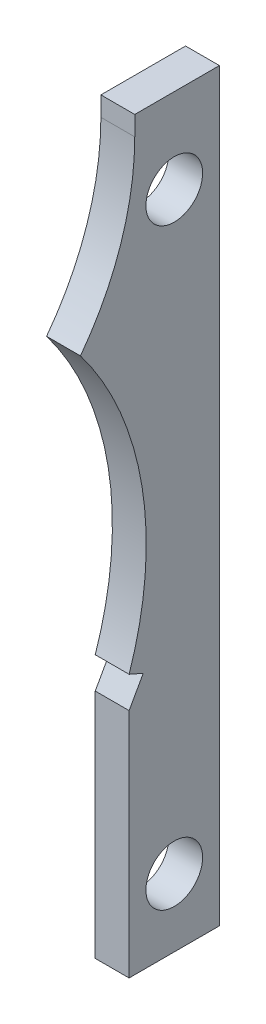
ISO-10303-21;
HEADER;
FILE_DESCRIPTION(('STEP AP214'),'2;1');
FILE_NAME('part.step','',(''),(''),'','','');
FILE_SCHEMA(('AUTOMOTIVE_DESIGN { 1 0 10303 214 1 1 1 1 }'));
ENDSEC;
DATA;
#1=APPLICATION_CONTEXT('core data for automotive mechanical design processes');
#2=APPLICATION_PROTOCOL_DEFINITION('international standard','automotive_design',2000,#1);
#3=PRODUCT_CONTEXT('',#1,'mechanical');
#4=PRODUCT('Part','Part','',(#3));
#5=PRODUCT_RELATED_PRODUCT_CATEGORY('part','',(#4));
#6=PRODUCT_DEFINITION_FORMATION('','',#4);
#7=PRODUCT_DEFINITION_CONTEXT('part definition',#1,'design');
#8=PRODUCT_DEFINITION('design','',#6,#7);
#9=PRODUCT_DEFINITION_SHAPE('','',#8);
#10=(LENGTH_UNIT() NAMED_UNIT(*) SI_UNIT(.MILLI.,.METRE.));
#11=(NAMED_UNIT(*) PLANE_ANGLE_UNIT() SI_UNIT($,.RADIAN.));
#12=(NAMED_UNIT(*) SI_UNIT($,.STERADIAN.) SOLID_ANGLE_UNIT());
#13=UNCERTAINTY_MEASURE_WITH_UNIT(LENGTH_MEASURE(1.E-05),#10,'distance_accuracy_value','');
#14=(GEOMETRIC_REPRESENTATION_CONTEXT(3) GLOBAL_UNCERTAINTY_ASSIGNED_CONTEXT((#13)) GLOBAL_UNIT_ASSIGNED_CONTEXT((#10,
#11,#12)) REPRESENTATION_CONTEXT('',''));
#15=CARTESIAN_POINT('',(0.,0.,0.));
#16=DIRECTION('',(0.,0.,1.));
#17=DIRECTION('',(1.,0.,0.));
#18=AXIS2_PLACEMENT_3D('',#15,#16,#17);
#19=CARTESIAN_POINT('',(3.,66.,0.));
#20=DIRECTION('',(0.,0.,1.));
#21=DIRECTION('',(0.,-1.,0.));
#22=AXIS2_PLACEMENT_3D('',#19,#20,#21);
#23=PLANE('',#22);
#24=DIRECTION('',(0.,1.,0.));
#25=VECTOR('',#24,1.);
#26=CARTESIAN_POINT('',(-3.,66.,0.));
#27=LINE('',#26,#25);
#28=CARTESIAN_POINT('',(-3.,-66.,0.));
#29=VERTEX_POINT('',#28);
#30=CARTESIAN_POINT('',(-3.,66.,0.));
#31=VERTEX_POINT('',#30);
#32=EDGE_CURVE('E134',#29,#31,#27,.T.);
#33=ORIENTED_EDGE('',*,*,#32,.T.);
#34=DIRECTION('',(-1.,0.,0.));
#35=VECTOR('',#34,1.);
#36=CARTESIAN_POINT('',(3.,66.,0.));
#37=LINE('',#36,#35);
#38=CARTESIAN_POINT('',(3.,66.,0.));
#39=VERTEX_POINT('',#38);
#40=EDGE_CURVE('E11',#39,#31,#37,.T.);
#41=ORIENTED_EDGE('',*,*,#40,.F.);
#42=DIRECTION('',(0.,1.,0.));
#43=VECTOR('',#42,1.);
#44=CARTESIAN_POINT('',(3.,66.,0.));
#45=LINE('',#44,#43);
#46=CARTESIAN_POINT('',(3.,-66.,0.));
#47=VERTEX_POINT('',#46);
#48=EDGE_CURVE('E151',#47,#39,#45,.T.);
#49=ORIENTED_EDGE('',*,*,#48,.F.);
#50=DIRECTION('',(-1.,0.,0.));
#51=VECTOR('',#50,1.);
#52=CARTESIAN_POINT('',(3.,-66.,0.));
#53=LINE('',#52,#51);
#54=EDGE_CURVE('E130',#47,#29,#53,.T.);
#55=ORIENTED_EDGE('',*,*,#54,.T.);
#56=EDGE_LOOP('',(#33,#41,#49,#55));
#57=FACE_BOUND('',#56,.T.);
#58=ADVANCED_FACE('F32',(#57),#23,.F.);
#59=CARTESIAN_POINT('',(3.,66.,0.));
#60=DIRECTION('',(0.,-1.,0.));
#61=DIRECTION('',(0.,0.,-1.));
#62=AXIS2_PLACEMENT_3D('',#59,#60,#61);
#63=PLANE('',#62);
#64=DIRECTION('',(0.,0.,1.));
#65=VECTOR('',#64,1.);
#66=CARTESIAN_POINT('',(-3.,66.,0.));
#67=LINE('',#66,#65);
#68=CARTESIAN_POINT('',(-3.,66.,15.));
#69=VERTEX_POINT('',#68);
#70=EDGE_CURVE('E137',#31,#69,#67,.T.);
#71=ORIENTED_EDGE('',*,*,#70,.T.);
#72=DIRECTION('',(-1.,0.,0.));
#73=VECTOR('',#72,1.);
#74=CARTESIAN_POINT('',(3.,66.,15.));
#75=LINE('',#74,#73);
#76=CARTESIAN_POINT('',(3.,66.,15.));
#77=VERTEX_POINT('',#76);
#78=EDGE_CURVE('E40',#77,#69,#75,.T.);
#79=ORIENTED_EDGE('',*,*,#78,.F.);
#80=DIRECTION('',(0.,0.,1.));
#81=VECTOR('',#80,1.);
#82=CARTESIAN_POINT('',(3.,66.,0.));
#83=LINE('',#82,#81);
#84=EDGE_CURVE('E94',#39,#77,#83,.T.);
#85=ORIENTED_EDGE('',*,*,#84,.F.);
#86=ORIENTED_EDGE('',*,*,#40,.T.);
#87=EDGE_LOOP('',(#71,#79,#85,#86));
#88=FACE_BOUND('',#87,.T.);
#89=ADVANCED_FACE('F228',(#88),#63,.F.);
#90=CARTESIAN_POINT('',(3.,66.,15.));
#91=DIRECTION('',(0.,0.,-1.));
#92=DIRECTION('',(0.,1.,0.));
#93=AXIS2_PLACEMENT_3D('',#90,#91,#92);
#94=PLANE('',#93);
#95=DIRECTION('',(0.,-1.,0.));
#96=VECTOR('',#95,1.);
#97=CARTESIAN_POINT('',(-3.,66.,15.));
#98=LINE('',#97,#96);
#99=CARTESIAN_POINT('',(-3.,62.56,15.));
#100=VERTEX_POINT('',#99);
#101=EDGE_CURVE('E140',#69,#100,#98,.T.);
#102=ORIENTED_EDGE('',*,*,#101,.T.);
#103=DIRECTION('',(-1.,0.,0.));
#104=VECTOR('',#103,1.);
#105=CARTESIAN_POINT('',(3.,62.56,15.));
#106=LINE('',#105,#104);
#107=CARTESIAN_POINT('',(3.,62.56,15.));
#108=VERTEX_POINT('',#107);
#109=EDGE_CURVE('E161',#108,#100,#106,.T.);
#110=ORIENTED_EDGE('',*,*,#109,.F.);
#111=DIRECTION('',(0.,-1.,0.));
#112=VECTOR('',#111,1.);
#113=CARTESIAN_POINT('',(3.,66.,15.));
#114=LINE('',#113,#112);
#115=EDGE_CURVE('E169',#77,#108,#114,.T.);
#116=ORIENTED_EDGE('',*,*,#115,.F.);
#117=ORIENTED_EDGE('',*,*,#78,.T.);
#118=EDGE_LOOP('',(#102,#110,#116,#117));
#119=FACE_BOUND('',#118,.T.);
#120=ADVANCED_FACE('F167',(#119),#94,.F.);
#121=CARTESIAN_POINT('',(3.,62.56,62.9));
#122=DIRECTION('',(-1.,0.,0.));
#123=DIRECTION('',(0.,0.,1.));
#124=AXIS2_PLACEMENT_3D('',#121,#122,#123);
#125=CYLINDRICAL_SURFACE('',#124,47.9);
#126=CARTESIAN_POINT('',(-3.,62.56,62.9));
#127=DIRECTION('',(-1.,0.,0.));
#128=DIRECTION('',(0.,0.,-1.));
#129=AXIS2_PLACEMENT_3D('',#126,#127,#128);
#130=CIRCLE('',#129,47.9);
#131=CARTESIAN_POINT('',(-3.,33.7654535309983,24.6209705759863));
#132=VERTEX_POINT('',#131);
#133=EDGE_CURVE('E142',#100,#132,#130,.T.);
#134=ORIENTED_EDGE('',*,*,#133,.T.);
#135=DIRECTION('',(-1.,0.,0.));
#136=VECTOR('',#135,1.);
#137=CARTESIAN_POINT('',(3.,33.7654535309983,24.6209705759863));
#138=LINE('',#137,#136);
#139=CARTESIAN_POINT('',(3.,33.7654535309983,24.6209705759863));
#140=VERTEX_POINT('',#139);
#141=EDGE_CURVE('E158',#140,#132,#138,.T.);
#142=ORIENTED_EDGE('',*,*,#141,.F.);
#143=CARTESIAN_POINT('',(3.,62.56,62.9));
#144=DIRECTION('',(-1.,0.,0.));
#145=DIRECTION('',(0.,0.,-1.));
#146=AXIS2_PLACEMENT_3D('',#143,#144,#145);
#147=CIRCLE('',#146,47.9);
#148=EDGE_CURVE('E185',#108,#140,#147,.T.);
#149=ORIENTED_EDGE('',*,*,#148,.F.);
#150=ORIENTED_EDGE('',*,*,#109,.T.);
#151=EDGE_LOOP('',(#134,#142,#149,#150));
#152=FACE_BOUND('',#151,.T.);
#153=ADVANCED_FACE('F178',(#152),#125,.F.);
#154=CARTESIAN_POINT('',(3.,-0.959999999999997,70.52));
#155=DIRECTION('',(-1.,0.,0.));
#156=DIRECTION('',(0.,0.,1.));
#157=AXIS2_PLACEMENT_3D('',#154,#155,#156);
#158=CYLINDRICAL_SURFACE('',#157,57.555);
#159=CARTESIAN_POINT('',(-3.,-0.959999999999997,70.52));
#160=DIRECTION('',(-1.,0.,0.));
#161=DIRECTION('',(0.,0.,-1.));
#162=AXIS2_PLACEMENT_3D('',#159,#160,#161);
#163=CIRCLE('',#162,57.555);
#164=CARTESIAN_POINT('',(-3.,-19.4030915250129,16.));
#165=VERTEX_POINT('',#164);
#166=EDGE_CURVE('E144',#132,#165,#163,.T.);
#167=ORIENTED_EDGE('',*,*,#166,.T.);
#168=DIRECTION('',(-1.,0.,0.));
#169=VECTOR('',#168,1.);
#170=CARTESIAN_POINT('',(3.,-19.4030915250129,16.));
#171=LINE('',#170,#169);
#172=CARTESIAN_POINT('',(3.,-19.4030915250129,16.));
#173=VERTEX_POINT('',#172);
#174=EDGE_CURVE('E155',#173,#165,#171,.T.);
#175=ORIENTED_EDGE('',*,*,#174,.F.);
#176=CARTESIAN_POINT('',(3.,-0.959999999999997,70.52));
#177=DIRECTION('',(-1.,0.,0.));
#178=DIRECTION('',(0.,0.,-1.));
#179=AXIS2_PLACEMENT_3D('',#176,#177,#178);
#180=CIRCLE('',#179,57.555);
#181=EDGE_CURVE('E184',#140,#173,#180,.T.);
#182=ORIENTED_EDGE('',*,*,#181,.F.);
#183=ORIENTED_EDGE('',*,*,#141,.T.);
#184=EDGE_LOOP('',(#167,#175,#182,#183));
#185=FACE_BOUND('',#184,.T.);
#186=ADVANCED_FACE('F182',(#185),#158,.F.);
#187=CARTESIAN_POINT('',(3.,-19.4030915250129,16.));
#188=DIRECTION('',(0.,0.915494413653172,-0.402330683107607));
#189=DIRECTION('',(0.,0.402330683107607,0.915494413653173));
#190=AXIS2_PLACEMENT_3D('',#187,#188,#189);
#191=PLANE('',#190);
#192=DIRECTION('',(0.,-0.402330683107607,-0.915494413653173));
#193=VECTOR('',#192,1.);
#194=CARTESIAN_POINT('',(-3.,-19.4030915250129,16.));
#195=LINE('',#194,#193);
#196=CARTESIAN_POINT('',(-3.,-20.5014542898966,13.5007002507268));
#197=VERTEX_POINT('',#196);
#198=EDGE_CURVE('E146',#165,#197,#195,.T.);
#199=ORIENTED_EDGE('',*,*,#198,.T.);
#200=DIRECTION('',(-1.,0.,0.));
#201=VECTOR('',#200,1.);
#202=CARTESIAN_POINT('',(3.,-20.5014542898966,13.5007002507268));
#203=LINE('',#202,#201);
#204=CARTESIAN_POINT('',(3.,-20.5014542898966,13.5007002507268));
#205=VERTEX_POINT('',#204);
#206=EDGE_CURVE('E125',#205,#197,#203,.T.);
#207=ORIENTED_EDGE('',*,*,#206,.F.);
#208=DIRECTION('',(0.,-0.402330683107607,-0.915494413653173));
#209=VECTOR('',#208,1.);
#210=CARTESIAN_POINT('',(3.,-19.4030915250129,16.));
#211=LINE('',#210,#209);
#212=EDGE_CURVE('E116',#173,#205,#211,.T.);
#213=ORIENTED_EDGE('',*,*,#212,.F.);
#214=ORIENTED_EDGE('',*,*,#174,.T.);
#215=EDGE_LOOP('',(#199,#207,#213,#214));
#216=FACE_BOUND('',#215,.T.);
#217=ADVANCED_FACE('F236',(#216),#191,.F.);
#218=CARTESIAN_POINT('',(3.,-20.5014542898966,13.5007002507268));
#219=DIRECTION('',(0.,-0.488144482279914,-0.872762834004562));
#220=DIRECTION('',(0.,0.872762834004562,-0.488144482279914));
#221=AXIS2_PLACEMENT_3D('',#218,#219,#220);
#222=PLANE('',#221);
#223=DIRECTION('',(0.,-0.872762834004562,0.488144482279914));
#224=VECTOR('',#223,1.);
#225=CARTESIAN_POINT('',(-3.,-20.5014542898966,13.5007002507268));
#226=LINE('',#225,#224);
#227=CARTESIAN_POINT('',(-3.,-24.97,16.));
#228=VERTEX_POINT('',#227);
#229=EDGE_CURVE('E124',#197,#228,#226,.T.);
#230=ORIENTED_EDGE('',*,*,#229,.T.);
#231=DIRECTION('',(-1.,0.,0.));
#232=VECTOR('',#231,1.);
#233=CARTESIAN_POINT('',(3.,-24.97,16.));
#234=LINE('',#233,#232);
#235=CARTESIAN_POINT('',(3.,-24.97,16.));
#236=VERTEX_POINT('',#235);
#237=EDGE_CURVE('E121',#236,#228,#234,.T.);
#238=ORIENTED_EDGE('',*,*,#237,.F.);
#239=DIRECTION('',(0.,-0.872762834004562,0.488144482279914));
#240=VECTOR('',#239,1.);
#241=CARTESIAN_POINT('',(3.,-20.5014542898966,13.5007002507268));
#242=LINE('',#241,#240);
#243=EDGE_CURVE('E110',#205,#236,#242,.T.);
#244=ORIENTED_EDGE('',*,*,#243,.F.);
#245=ORIENTED_EDGE('',*,*,#206,.T.);
#246=EDGE_LOOP('',(#230,#238,#244,#245));
#247=FACE_BOUND('',#246,.T.);
#248=ADVANCED_FACE('F122',(#247),#222,.F.);
#249=CARTESIAN_POINT('',(3.,-24.97,16.));
#250=DIRECTION('',(0.,0.,-1.));
#251=DIRECTION('',(0.,1.,0.));
#252=AXIS2_PLACEMENT_3D('',#249,#250,#251);
#253=PLANE('',#252);
#254=DIRECTION('',(0.,-1.,0.));
#255=VECTOR('',#254,1.);
#256=CARTESIAN_POINT('',(-3.,-24.97,16.));
#257=LINE('',#256,#255);
#258=CARTESIAN_POINT('',(-3.,-66.,16.));
#259=VERTEX_POINT('',#258);
#260=EDGE_CURVE('E80',#228,#259,#257,.T.);
#261=ORIENTED_EDGE('',*,*,#260,.T.);
#262=DIRECTION('',(-1.,0.,0.));
#263=VECTOR('',#262,1.);
#264=CARTESIAN_POINT('',(3.,-66.,16.));
#265=LINE('',#264,#263);
#266=CARTESIAN_POINT('',(3.,-66.,16.));
#267=VERTEX_POINT('',#266);
#268=EDGE_CURVE('E126',#267,#259,#265,.T.);
#269=ORIENTED_EDGE('',*,*,#268,.F.);
#270=DIRECTION('',(0.,-1.,0.));
#271=VECTOR('',#270,1.);
#272=CARTESIAN_POINT('',(3.,-24.97,16.));
#273=LINE('',#272,#271);
#274=EDGE_CURVE('E114',#236,#267,#273,.T.);
#275=ORIENTED_EDGE('',*,*,#274,.F.);
#276=ORIENTED_EDGE('',*,*,#237,.T.);
#277=EDGE_LOOP('',(#261,#269,#275,#276));
#278=FACE_BOUND('',#277,.T.);
#279=ADVANCED_FACE('F128',(#278),#253,.F.);
#280=CARTESIAN_POINT('',(3.,-66.,0.));
#281=DIRECTION('',(0.,1.,0.));
#282=DIRECTION('',(0.,0.,1.));
#283=AXIS2_PLACEMENT_3D('',#280,#281,#282);
#284=PLANE('',#283);
#285=DIRECTION('',(0.,0.,-1.));
#286=VECTOR('',#285,1.);
#287=CARTESIAN_POINT('',(-3.,-66.,0.));
#288=LINE('',#287,#286);
#289=EDGE_CURVE('E86',#259,#29,#288,.T.);
#290=ORIENTED_EDGE('',*,*,#289,.T.);
#291=ORIENTED_EDGE('',*,*,#54,.F.);
#292=DIRECTION('',(0.,0.,-1.));
#293=VECTOR('',#292,1.);
#294=CARTESIAN_POINT('',(3.,-66.,0.));
#295=LINE('',#294,#293);
#296=EDGE_CURVE('E48',#267,#47,#295,.T.);
#297=ORIENTED_EDGE('',*,*,#296,.F.);
#298=ORIENTED_EDGE('',*,*,#268,.T.);
#299=EDGE_LOOP('',(#290,#291,#297,#298));
#300=FACE_BOUND('',#299,.T.);
#301=ADVANCED_FACE('F215',(#300),#284,.F.);
#302=CARTESIAN_POINT('',(3.,-0.959999999999997,70.52));
#303=DIRECTION('',(1.,0.,0.));
#304=DIRECTION('',(0.,0.,-1.));
#305=AXIS2_PLACEMENT_3D('',#302,#303,#304);
#306=PLANE('',#305);
#307=CARTESIAN_POINT('',(3.,51.,8.));
#308=DIRECTION('',(1.,0.,0.));
#309=DIRECTION('',(0.,0.,-1.));
#310=AXIS2_PLACEMENT_3D('',#307,#308,#309);
#311=CIRCLE('',#310,5.025);
#312=CARTESIAN_POINT('',(3.,51.,2.975));
#313=VERTEX_POINT('',#312);
#314=EDGE_CURVE('E198',#313,#313,#311,.T.);
#315=ORIENTED_EDGE('',*,*,#314,.F.);
#316=EDGE_LOOP('',(#315));
#317=FACE_BOUND('',#316,.T.);
#318=CARTESIAN_POINT('',(3.,-54.,8.));
#319=DIRECTION('',(1.,0.,0.));
#320=DIRECTION('',(0.,0.,-1.));
#321=AXIS2_PLACEMENT_3D('',#318,#319,#320);
#322=CIRCLE('',#321,5.025);
#323=CARTESIAN_POINT('',(3.,-54.,2.975));
#324=VERTEX_POINT('',#323);
#325=EDGE_CURVE('E192',#324,#324,#322,.T.);
#326=ORIENTED_EDGE('',*,*,#325,.F.);
#327=EDGE_LOOP('',(#326));
#328=FACE_BOUND('',#327,.T.);
#329=ORIENTED_EDGE('',*,*,#48,.T.);
#330=ORIENTED_EDGE('',*,*,#84,.T.);
#331=ORIENTED_EDGE('',*,*,#115,.T.);
#332=ORIENTED_EDGE('',*,*,#148,.T.);
#333=ORIENTED_EDGE('',*,*,#181,.T.);
#334=ORIENTED_EDGE('',*,*,#212,.T.);
#335=ORIENTED_EDGE('',*,*,#243,.T.);
#336=ORIENTED_EDGE('',*,*,#274,.T.);
#337=ORIENTED_EDGE('',*,*,#296,.T.);
#338=EDGE_LOOP('',(#329,#330,#331,#332,#333,#334,#335,#336,#337));
#339=FACE_BOUND('',#338,.T.);
#340=ADVANCED_FACE('F112',(#317,#328,#339),#306,.T.);
#341=CARTESIAN_POINT('',(-3.,-0.959999999999997,70.52));
#342=DIRECTION('',(1.,0.,0.));
#343=DIRECTION('',(0.,0.,-1.));
#344=AXIS2_PLACEMENT_3D('',#341,#342,#343);
#345=PLANE('',#344);
#346=CARTESIAN_POINT('',(-3.,51.,8.));
#347=DIRECTION('',(1.,0.,0.));
#348=DIRECTION('',(0.,0.,-1.));
#349=AXIS2_PLACEMENT_3D('',#346,#347,#348);
#350=CIRCLE('',#349,5.025);
#351=CARTESIAN_POINT('',(-3.,51.,2.975));
#352=VERTEX_POINT('',#351);
#353=EDGE_CURVE('E138',#352,#352,#350,.T.);
#354=ORIENTED_EDGE('',*,*,#353,.T.);
#355=EDGE_LOOP('',(#354));
#356=FACE_BOUND('',#355,.T.);
#357=CARTESIAN_POINT('',(-3.,-54.,8.));
#358=DIRECTION('',(1.,0.,0.));
#359=DIRECTION('',(0.,0.,-1.));
#360=AXIS2_PLACEMENT_3D('',#357,#358,#359);
#361=CIRCLE('',#360,5.025);
#362=CARTESIAN_POINT('',(-3.,-54.,2.975));
#363=VERTEX_POINT('',#362);
#364=EDGE_CURVE('E195',#363,#363,#361,.T.);
#365=ORIENTED_EDGE('',*,*,#364,.T.);
#366=EDGE_LOOP('',(#365));
#367=FACE_BOUND('',#366,.T.);
#368=ORIENTED_EDGE('',*,*,#32,.F.);
#369=ORIENTED_EDGE('',*,*,#289,.F.);
#370=ORIENTED_EDGE('',*,*,#260,.F.);
#371=ORIENTED_EDGE('',*,*,#229,.F.);
#372=ORIENTED_EDGE('',*,*,#198,.F.);
#373=ORIENTED_EDGE('',*,*,#166,.F.);
#374=ORIENTED_EDGE('',*,*,#133,.F.);
#375=ORIENTED_EDGE('',*,*,#101,.F.);
#376=ORIENTED_EDGE('',*,*,#70,.F.);
#377=EDGE_LOOP('',(#368,#369,#370,#371,#372,#373,#374,#375,#376));
#378=FACE_BOUND('',#377,.T.);
#379=ADVANCED_FACE('F173',(#356,#367,#378),#345,.F.);
#380=CARTESIAN_POINT('',(-3.,-54.,8.));
#381=DIRECTION('',(1.,0.,0.));
#382=DIRECTION('',(0.,0.,-1.));
#383=AXIS2_PLACEMENT_3D('',#380,#381,#382);
#384=CYLINDRICAL_SURFACE('',#383,5.025);
#385=ORIENTED_EDGE('',*,*,#364,.F.);
#386=EDGE_LOOP('',(#385));
#387=FACE_BOUND('',#386,.T.);
#388=ORIENTED_EDGE('',*,*,#325,.T.);
#389=EDGE_LOOP('',(#388));
#390=FACE_BOUND('',#389,.T.);
#391=ADVANCED_FACE('F209',(#387,#390),#384,.F.);
#392=CARTESIAN_POINT('',(-3.,51.,8.));
#393=DIRECTION('',(1.,0.,0.));
#394=DIRECTION('',(0.,0.,-1.));
#395=AXIS2_PLACEMENT_3D('',#392,#393,#394);
#396=CYLINDRICAL_SURFACE('',#395,5.025);
#397=ORIENTED_EDGE('',*,*,#353,.F.);
#398=EDGE_LOOP('',(#397));
#399=FACE_BOUND('',#398,.T.);
#400=ORIENTED_EDGE('',*,*,#314,.T.);
#401=EDGE_LOOP('',(#400));
#402=FACE_BOUND('',#401,.T.);
#403=ADVANCED_FACE('F206',(#399,#402),#396,.F.);
#404=CLOSED_SHELL('',(#58,#89,#120,#153,#186,#217,#248,#279,#301,#340,#379,#391,#403));
#405=MANIFOLD_SOLID_BREP('B2',#404);
#406=ADVANCED_BREP_SHAPE_REPRESENTATION('',(#18,#405),#14);
#407=SHAPE_DEFINITION_REPRESENTATION(#9,#406);
ENDSEC;
END-ISO-10303-21;
